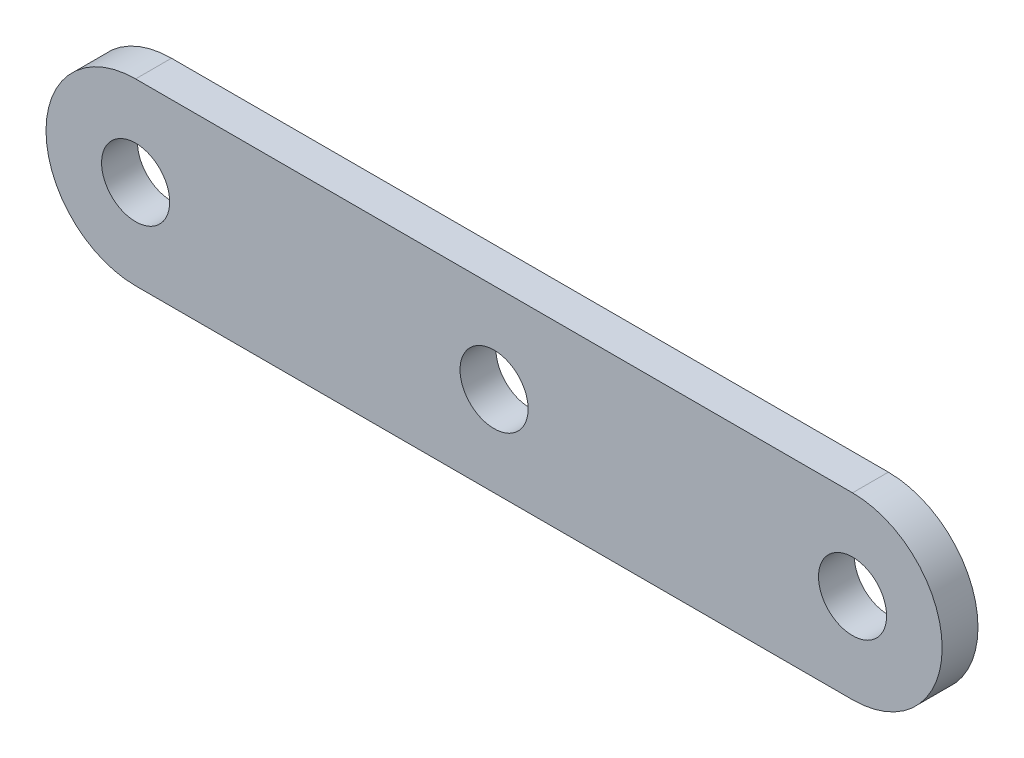
ISO-10303-21;
HEADER;
FILE_DESCRIPTION(('STEP AP214'),'2;1');
FILE_NAME('part.step','',(''),(''),'','','');
FILE_SCHEMA(('AUTOMOTIVE_DESIGN { 1 0 10303 214 1 1 1 1 }'));
ENDSEC;
DATA;
#1=APPLICATION_CONTEXT('core data for automotive mechanical design processes');
#2=APPLICATION_PROTOCOL_DEFINITION('international standard','automotive_design',2000,#1);
#3=PRODUCT_CONTEXT('',#1,'mechanical');
#4=PRODUCT('Part','Part','',(#3));
#5=PRODUCT_RELATED_PRODUCT_CATEGORY('part','',(#4));
#6=PRODUCT_DEFINITION_FORMATION('','',#4);
#7=PRODUCT_DEFINITION_CONTEXT('part definition',#1,'design');
#8=PRODUCT_DEFINITION('design','',#6,#7);
#9=PRODUCT_DEFINITION_SHAPE('','',#8);
#10=(LENGTH_UNIT() NAMED_UNIT(*) SI_UNIT(.MILLI.,.METRE.));
#11=(NAMED_UNIT(*) PLANE_ANGLE_UNIT() SI_UNIT($,.RADIAN.));
#12=(NAMED_UNIT(*) SI_UNIT($,.STERADIAN.) SOLID_ANGLE_UNIT());
#13=UNCERTAINTY_MEASURE_WITH_UNIT(LENGTH_MEASURE(1.E-05),#10,'distance_accuracy_value','');
#14=(GEOMETRIC_REPRESENTATION_CONTEXT(3) GLOBAL_UNCERTAINTY_ASSIGNED_CONTEXT((#13)) GLOBAL_UNIT_ASSIGNED_CONTEXT((#10,
#11,#12)) REPRESENTATION_CONTEXT('',''));
#15=CARTESIAN_POINT('',(0.,0.,0.));
#16=DIRECTION('',(0.,0.,1.));
#17=DIRECTION('',(1.,0.,0.));
#18=AXIS2_PLACEMENT_3D('',#15,#16,#17);
#19=CARTESIAN_POINT('',(-25.4,-3.46944695195361E-13,2.54000000000008));
#20=DIRECTION('',(0.,0.,-0.999999999999999));
#21=DIRECTION('',(-1.,0.,0.));
#22=AXIS2_PLACEMENT_3D('',#19,#20,#21);
#23=CYLINDRICAL_SURFACE('',#22,6.35);
#24=CARTESIAN_POINT('',(-25.4,-3.46944695195361E-13,0.));
#25=DIRECTION('',(0.,0.,0.999999999999999));
#26=DIRECTION('',(1.,0.,0.));
#27=AXIS2_PLACEMENT_3D('',#24,#25,#26);
#28=CIRCLE('',#27,6.35);
#29=CARTESIAN_POINT('',(-25.4000000000003,6.34999999999969,0.));
#30=VERTEX_POINT('',#29);
#31=CARTESIAN_POINT('',(-25.4000000000003,-6.35000000000032,0.));
#32=VERTEX_POINT('',#31);
#33=EDGE_CURVE('E97',#30,#32,#28,.T.);
#34=ORIENTED_EDGE('',*,*,#33,.T.);
#35=DIRECTION('',(0.,0.,-0.999999999999999));
#36=VECTOR('',#35,1.);
#37=CARTESIAN_POINT('',(-25.4000000000003,-6.35000000000032,2.54));
#38=LINE('',#37,#36);
#39=CARTESIAN_POINT('',(-25.4000000000003,-6.35000000000032,2.54));
#40=VERTEX_POINT('',#39);
#41=EDGE_CURVE('E11',#40,#32,#38,.T.);
#42=ORIENTED_EDGE('',*,*,#41,.F.);
#43=CARTESIAN_POINT('',(-25.4,-3.46944695195361E-13,2.54000000000008));
#44=DIRECTION('',(0.,0.,0.999999999999999));
#45=DIRECTION('',(1.,0.,0.));
#46=AXIS2_PLACEMENT_3D('',#43,#44,#45);
#47=CIRCLE('',#46,6.35);
#48=CARTESIAN_POINT('',(-25.4000000000003,6.34999999999969,2.54000000000004));
#49=VERTEX_POINT('',#48);
#50=EDGE_CURVE('E85',#49,#40,#47,.T.);
#51=ORIENTED_EDGE('',*,*,#50,.F.);
#52=DIRECTION('',(0.,0.,-0.999999999999999));
#53=VECTOR('',#52,1.);
#54=CARTESIAN_POINT('',(-25.4000000000003,6.34999999999969,2.54000000000004));
#55=LINE('',#54,#53);
#56=EDGE_CURVE('E93',#49,#30,#55,.T.);
#57=ORIENTED_EDGE('',*,*,#56,.T.);
#58=EDGE_LOOP('',(#34,#42,#51,#57));
#59=FACE_BOUND('',#58,.T.);
#60=ADVANCED_FACE('F34',(#59),#23,.T.);
#61=CARTESIAN_POINT('',(-25.4000000000003,-6.35000000000032,2.54));
#62=DIRECTION('',(0.,1.,0.));
#63=DIRECTION('',(-1.,0.,0.));
#64=AXIS2_PLACEMENT_3D('',#61,#62,#63);
#65=PLANE('',#64);
#66=DIRECTION('',(1.,0.,0.));
#67=VECTOR('',#66,1.);
#68=CARTESIAN_POINT('',(-25.4000000000003,-6.35000000000032,0.));
#69=LINE('',#68,#67);
#70=CARTESIAN_POINT('',(25.3999999999997,-6.35000000000033,0.));
#71=VERTEX_POINT('',#70);
#72=EDGE_CURVE('E89',#32,#71,#69,.T.);
#73=ORIENTED_EDGE('',*,*,#72,.T.);
#74=DIRECTION('',(0.,0.,-0.999999999999999));
#75=VECTOR('',#74,1.);
#76=CARTESIAN_POINT('',(25.3999999999997,-6.35000000000033,2.54));
#77=LINE('',#76,#75);
#78=CARTESIAN_POINT('',(25.3999999999997,-6.35000000000033,2.54));
#79=VERTEX_POINT('',#78);
#80=EDGE_CURVE('E42',#79,#71,#77,.T.);
#81=ORIENTED_EDGE('',*,*,#80,.F.);
#82=DIRECTION('',(1.,0.,0.));
#83=VECTOR('',#82,1.);
#84=CARTESIAN_POINT('',(-25.4000000000003,-6.35000000000032,2.54));
#85=LINE('',#84,#83);
#86=EDGE_CURVE('E80',#40,#79,#85,.T.);
#87=ORIENTED_EDGE('',*,*,#86,.F.);
#88=ORIENTED_EDGE('',*,*,#41,.T.);
#89=EDGE_LOOP('',(#73,#81,#87,#88));
#90=FACE_BOUND('',#89,.T.);
#91=ADVANCED_FACE('F88',(#90),#65,.F.);
#92=CARTESIAN_POINT('',(25.4,-3.33066907387547E-13,2.54000000000008));
#93=DIRECTION('',(0.,0.,-0.999999999999999));
#94=DIRECTION('',(-1.,0.,0.));
#95=AXIS2_PLACEMENT_3D('',#92,#93,#94);
#96=CYLINDRICAL_SURFACE('',#95,6.35);
#97=CARTESIAN_POINT('',(25.4,-3.33066907387547E-13,0.));
#98=DIRECTION('',(0.,0.,0.999999999999999));
#99=DIRECTION('',(-1.,0.,0.));
#100=AXIS2_PLACEMENT_3D('',#97,#98,#99);
#101=CIRCLE('',#100,6.35);
#102=CARTESIAN_POINT('',(25.3999999999997,6.34999999999968,0.));
#103=VERTEX_POINT('',#102);
#104=EDGE_CURVE('E67',#71,#103,#101,.T.);
#105=ORIENTED_EDGE('',*,*,#104,.T.);
#106=DIRECTION('',(0.,0.,-0.999999999999999));
#107=VECTOR('',#106,1.);
#108=CARTESIAN_POINT('',(25.3999999999997,6.34999999999968,2.54));
#109=LINE('',#108,#107);
#110=CARTESIAN_POINT('',(25.3999999999997,6.34999999999968,2.54));
#111=VERTEX_POINT('',#110);
#112=EDGE_CURVE('E90',#111,#103,#109,.T.);
#113=ORIENTED_EDGE('',*,*,#112,.F.);
#114=CARTESIAN_POINT('',(25.4,-3.33066907387547E-13,2.54000000000008));
#115=DIRECTION('',(0.,0.,0.999999999999999));
#116=DIRECTION('',(-1.,0.,0.));
#117=AXIS2_PLACEMENT_3D('',#114,#115,#116);
#118=CIRCLE('',#117,6.35);
#119=EDGE_CURVE('E83',#79,#111,#118,.T.);
#120=ORIENTED_EDGE('',*,*,#119,.F.);
#121=ORIENTED_EDGE('',*,*,#80,.T.);
#122=EDGE_LOOP('',(#105,#113,#120,#121));
#123=FACE_BOUND('',#122,.T.);
#124=ADVANCED_FACE('F91',(#123),#96,.T.);
#125=CARTESIAN_POINT('',(-25.4000000000003,6.34999999999969,2.54000000000004));
#126=DIRECTION('',(0.,-1.,0.));
#127=DIRECTION('',(0.,0.,-0.999999999999999));
#128=AXIS2_PLACEMENT_3D('',#125,#126,#127);
#129=PLANE('',#128);
#130=DIRECTION('',(-1.,0.,0.));
#131=VECTOR('',#130,1.);
#132=CARTESIAN_POINT('',(-25.4000000000003,6.34999999999969,0.));
#133=LINE('',#132,#131);
#134=EDGE_CURVE('E73',#103,#30,#133,.T.);
#135=ORIENTED_EDGE('',*,*,#134,.T.);
#136=ORIENTED_EDGE('',*,*,#56,.F.);
#137=DIRECTION('',(-1.,0.,0.));
#138=VECTOR('',#137,1.);
#139=CARTESIAN_POINT('',(-25.4000000000003,6.34999999999969,2.54000000000004));
#140=LINE('',#139,#138);
#141=EDGE_CURVE('E50',#111,#49,#140,.T.);
#142=ORIENTED_EDGE('',*,*,#141,.F.);
#143=ORIENTED_EDGE('',*,*,#112,.T.);
#144=EDGE_LOOP('',(#135,#136,#142,#143));
#145=FACE_BOUND('',#144,.T.);
#146=ADVANCED_FACE('F105',(#145),#129,.F.);
#147=CARTESIAN_POINT('',(-25.4,-3.46944695195361E-13,2.54000000000008));
#148=DIRECTION('',(0.,0.,0.999999999999999));
#149=DIRECTION('',(1.,0.,0.));
#150=AXIS2_PLACEMENT_3D('',#147,#148,#149);
#151=PLANE('',#150);
#152=CARTESIAN_POINT('',(25.4,-3.60822483003176E-13,2.54000000000008));
#153=DIRECTION('',(0.,0.,0.999999999999999));
#154=DIRECTION('',(1.,0.,0.));
#155=AXIS2_PLACEMENT_3D('',#152,#153,#154);
#156=CIRCLE('',#155,2.413);
#157=CARTESIAN_POINT('',(27.813,-3.60822483003176E-13,2.54000000000008));
#158=VERTEX_POINT('',#157);
#159=EDGE_CURVE('E122',#158,#158,#156,.T.);
#160=ORIENTED_EDGE('',*,*,#159,.F.);
#161=EDGE_LOOP('',(#160));
#162=FACE_BOUND('',#161,.T.);
#163=CARTESIAN_POINT('',(0.,0.,2.54));
#164=DIRECTION('',(0.,0.,0.999999999999999));
#165=DIRECTION('',(1.,0.,0.));
#166=AXIS2_PLACEMENT_3D('',#163,#164,#165);
#167=CIRCLE('',#166,2.413);
#168=CARTESIAN_POINT('',(2.413,0.,2.54));
#169=VERTEX_POINT('',#168);
#170=EDGE_CURVE('E114',#169,#169,#167,.T.);
#171=ORIENTED_EDGE('',*,*,#170,.F.);
#172=EDGE_LOOP('',(#171));
#173=FACE_BOUND('',#172,.T.);
#174=CARTESIAN_POINT('',(-25.4,-3.46944695195361E-13,2.54000000000008));
#175=DIRECTION('',(0.,0.,0.999999999999999));
#176=DIRECTION('',(1.,0.,0.));
#177=AXIS2_PLACEMENT_3D('',#174,#175,#176);
#178=CIRCLE('',#177,2.413);
#179=CARTESIAN_POINT('',(-22.987,-3.46944695195361E-13,2.54000000000008));
#180=VERTEX_POINT('',#179);
#181=EDGE_CURVE('E111',#180,#180,#178,.T.);
#182=ORIENTED_EDGE('',*,*,#181,.F.);
#183=EDGE_LOOP('',(#182));
#184=FACE_BOUND('',#183,.T.);
#185=ORIENTED_EDGE('',*,*,#50,.T.);
#186=ORIENTED_EDGE('',*,*,#86,.T.);
#187=ORIENTED_EDGE('',*,*,#119,.T.);
#188=ORIENTED_EDGE('',*,*,#141,.T.);
#189=EDGE_LOOP('',(#185,#186,#187,#188));
#190=FACE_BOUND('',#189,.T.);
#191=ADVANCED_FACE('F81',(#162,#173,#184,#190),#151,.T.);
#192=CARTESIAN_POINT('',(-25.4,-3.46944695195361E-13,0.));
#193=DIRECTION('',(0.,0.,0.999999999999999));
#194=DIRECTION('',(1.,0.,0.));
#195=AXIS2_PLACEMENT_3D('',#192,#193,#194);
#196=PLANE('',#195);
#197=CARTESIAN_POINT('',(25.4,-3.60822483003176E-13,0.));
#198=DIRECTION('',(0.,0.,0.999999999999999));
#199=DIRECTION('',(1.,0.,0.));
#200=AXIS2_PLACEMENT_3D('',#197,#198,#199);
#201=CIRCLE('',#200,2.413);
#202=CARTESIAN_POINT('',(27.813,-3.60822483003176E-13,0.));
#203=VERTEX_POINT('',#202);
#204=EDGE_CURVE('E125',#203,#203,#201,.T.);
#205=ORIENTED_EDGE('',*,*,#204,.T.);
#206=EDGE_LOOP('',(#205));
#207=FACE_BOUND('',#206,.T.);
#208=CARTESIAN_POINT('',(0.,0.,0.));
#209=DIRECTION('',(0.,0.,0.999999999999999));
#210=DIRECTION('',(1.,0.,0.));
#211=AXIS2_PLACEMENT_3D('',#208,#209,#210);
#212=CIRCLE('',#211,2.413);
#213=CARTESIAN_POINT('',(2.413,0.,0.));
#214=VERTEX_POINT('',#213);
#215=EDGE_CURVE('E119',#214,#214,#212,.T.);
#216=ORIENTED_EDGE('',*,*,#215,.T.);
#217=EDGE_LOOP('',(#216));
#218=FACE_BOUND('',#217,.T.);
#219=CARTESIAN_POINT('',(-25.4,-3.46944695195361E-13,0.));
#220=DIRECTION('',(0.,0.,0.999999999999999));
#221=DIRECTION('',(1.,0.,0.));
#222=AXIS2_PLACEMENT_3D('',#219,#220,#221);
#223=CIRCLE('',#222,2.413);
#224=CARTESIAN_POINT('',(-22.987,-3.46944695195361E-13,0.));
#225=VERTEX_POINT('',#224);
#226=EDGE_CURVE('E100',#225,#225,#223,.T.);
#227=ORIENTED_EDGE('',*,*,#226,.T.);
#228=EDGE_LOOP('',(#227));
#229=FACE_BOUND('',#228,.T.);
#230=ORIENTED_EDGE('',*,*,#33,.F.);
#231=ORIENTED_EDGE('',*,*,#134,.F.);
#232=ORIENTED_EDGE('',*,*,#104,.F.);
#233=ORIENTED_EDGE('',*,*,#72,.F.);
#234=EDGE_LOOP('',(#230,#231,#232,#233));
#235=FACE_BOUND('',#234,.T.);
#236=ADVANCED_FACE('F108',(#207,#218,#229,#235),#196,.F.);
#237=CARTESIAN_POINT('',(-25.4,-3.46944695195361E-13,0.));
#238=DIRECTION('',(0.,0.,0.999999999999999));
#239=DIRECTION('',(1.,0.,0.));
#240=AXIS2_PLACEMENT_3D('',#237,#238,#239);
#241=CYLINDRICAL_SURFACE('',#240,2.413);
#242=CARTESIAN_POINT('',(-22.987,-3.46944695195361E-13,0.));
#243=CARTESIAN_POINT('',(-22.987,-3.46944695195361E-13,0.0264583333333736));
#244=CARTESIAN_POINT('',(-22.987,-3.46944695195361E-13,0.0529166666667073));
#245=CARTESIAN_POINT('',(-22.987,-3.46944695195361E-13,0.105833333333375));
#246=CARTESIAN_POINT('',(-22.987,-3.46944695195361E-13,0.132291666666708));
#247=CARTESIAN_POINT('',(-22.987,-3.46944695195361E-13,0.185208333333376));
#248=CARTESIAN_POINT('',(-22.987,-3.46944695195361E-13,0.21166666666671));
#249=CARTESIAN_POINT('',(-22.987,-3.46944695195361E-13,0.264583333333377));
#250=CARTESIAN_POINT('',(-22.987,-3.46944695195361E-13,0.291041666666711));
#251=CARTESIAN_POINT('',(-22.987,-3.46944695195361E-13,0.343958333333378));
#252=CARTESIAN_POINT('',(-22.987,-3.46944695195361E-13,0.370416666666712));
#253=CARTESIAN_POINT('',(-22.987,-3.46944695195361E-13,0.423333333333379));
#254=CARTESIAN_POINT('',(-22.987,-3.46944695195361E-13,0.449791666666713));
#255=CARTESIAN_POINT('',(-22.987,-3.46944695195361E-13,0.50270833333338));
#256=CARTESIAN_POINT('',(-22.987,-3.46944695195361E-13,0.529166666666714));
#257=CARTESIAN_POINT('',(-22.987,-3.46944695195361E-13,0.582083333333382));
#258=CARTESIAN_POINT('',(-22.987,-3.46944695195361E-13,0.608541666666715));
#259=CARTESIAN_POINT('',(-22.987,-3.46944695195361E-13,0.661458333333383));
#260=CARTESIAN_POINT('',(-22.987,-3.46944695195361E-13,0.687916666666716));
#261=CARTESIAN_POINT('',(-22.987,-3.46944695195361E-13,0.740833333333384));
#262=CARTESIAN_POINT('',(-22.987,-3.46944695195361E-13,0.767291666666718));
#263=CARTESIAN_POINT('',(-22.987,-3.46944695195361E-13,0.820208333333385));
#264=CARTESIAN_POINT('',(-22.987,-3.46944695195361E-13,0.846666666666719));
#265=CARTESIAN_POINT('',(-22.987,-3.46944695195361E-13,0.899583333333386));
#266=CARTESIAN_POINT('',(-22.987,-3.46944695195361E-13,0.92604166666672));
#267=CARTESIAN_POINT('',(-22.987,-3.46944695195361E-13,0.978958333333387));
#268=CARTESIAN_POINT('',(-22.987,-3.46944695195361E-13,1.00541666666672));
#269=CARTESIAN_POINT('',(-22.987,-3.46944695195361E-13,1.05833333333339));
#270=CARTESIAN_POINT('',(-22.987,-3.46944695195361E-13,1.08479166666672));
#271=CARTESIAN_POINT('',(-22.987,-3.46944695195361E-13,1.13770833333339));
#272=CARTESIAN_POINT('',(-22.987,-3.46944695195361E-13,1.16416666666672));
#273=CARTESIAN_POINT('',(-22.987,-3.46944695195361E-13,1.21708333333339));
#274=CARTESIAN_POINT('',(-22.987,-3.46944695195361E-13,1.24354166666672));
#275=CARTESIAN_POINT('',(-22.987,-3.46944695195361E-13,1.29645833333339));
#276=CARTESIAN_POINT('',(-22.987,-3.46944695195361E-13,1.32291666666673));
#277=CARTESIAN_POINT('',(-22.987,-3.46944695195361E-13,1.37583333333339));
#278=CARTESIAN_POINT('',(-22.987,-3.46944695195361E-13,1.40229166666673));
#279=CARTESIAN_POINT('',(-22.987,-3.46944695195361E-13,1.45520833333339));
#280=CARTESIAN_POINT('',(-22.987,-3.46944695195361E-13,1.48166666666673));
#281=CARTESIAN_POINT('',(-22.987,-3.46944695195361E-13,1.5345833333334));
#282=CARTESIAN_POINT('',(-22.987,-3.46944695195361E-13,1.56104166666673));
#283=CARTESIAN_POINT('',(-22.987,-3.46944695195361E-13,1.6139583333334));
#284=CARTESIAN_POINT('',(-22.987,-3.46944695195361E-13,1.64041666666673));
#285=CARTESIAN_POINT('',(-22.987,-3.46944695195361E-13,1.6933333333334));
#286=CARTESIAN_POINT('',(-22.987,-3.46944695195361E-13,1.71979166666673));
#287=CARTESIAN_POINT('',(-22.987,-3.46944695195361E-13,1.7727083333334));
#288=CARTESIAN_POINT('',(-22.987,-3.46944695195361E-13,1.79916666666673));
#289=CARTESIAN_POINT('',(-22.987,-3.46944695195361E-13,1.8520833333334));
#290=CARTESIAN_POINT('',(-22.987,-3.46944695195361E-13,1.87854166666673));
#291=CARTESIAN_POINT('',(-22.987,-3.46944695195361E-13,1.9314583333334));
#292=CARTESIAN_POINT('',(-22.987,-3.46944695195361E-13,1.95791666666673));
#293=CARTESIAN_POINT('',(-22.987,-3.46944695195361E-13,2.0108333333334));
#294=CARTESIAN_POINT('',(-22.987,-3.46944695195361E-13,2.03729166666674));
#295=CARTESIAN_POINT('',(-22.987,-3.46944695195361E-13,2.0902083333334));
#296=CARTESIAN_POINT('',(-22.987,-3.46944695195361E-13,2.11666666666674));
#297=CARTESIAN_POINT('',(-22.987,-3.46944695195361E-13,2.1695833333334));
#298=CARTESIAN_POINT('',(-22.987,-3.46944695195361E-13,2.19604166666674));
#299=CARTESIAN_POINT('',(-22.987,-3.46944695195361E-13,2.24895833333341));
#300=CARTESIAN_POINT('',(-22.987,-3.46944695195361E-13,2.27541666666674));
#301=CARTESIAN_POINT('',(-22.987,-3.46944695195361E-13,2.32833333333341));
#302=CARTESIAN_POINT('',(-22.987,-3.46944695195361E-13,2.35479166666674));
#303=CARTESIAN_POINT('',(-22.987,-3.46944695195361E-13,2.40770833333341));
#304=CARTESIAN_POINT('',(-22.987,-3.46944695195361E-13,2.43416666666674));
#305=CARTESIAN_POINT('',(-22.987,-3.46944695195361E-13,2.48708333333341));
#306=CARTESIAN_POINT('',(-22.987,-3.46944695195361E-13,2.51354166666674));
#307=CARTESIAN_POINT('',(-22.987,-3.46944695195361E-13,2.54000000000008));
#308=B_SPLINE_CURVE_WITH_KNOTS('',3,(#242,#243,#244,#245,#246,#247,#248,#249,#250,#251,#252,
#253,#254,#255,#256,#257,#258,#259,#260,#261,#262,#263,#264,#265,#266,#267,#268,#269,#270,#271,
#272,#273,#274,#275,#276,#277,#278,#279,#280,#281,#282,#283,#284,#285,#286,#287,#288,#289,#290,
#291,#292,#293,#294,#295,#296,#297,#298,#299,#300,#301,#302,#303,#304,#305,#306,#307),
.UNSPECIFIED.,.F.,.F.,(4,2,2,2,2,2,2,2,2,2,2,2,2,2,2,2,2,2,2,2,2,2,2,2,2,2,2,2,2,2,2,2,4),(0.,
0.0793750000000011,0.158750000000002,0.238125000000003,0.317500000000005,0.396875000000006,
0.476250000000007,0.555625000000008,0.635000000000009,0.71437500000001,0.793750000000011,
0.873125000000013,0.952500000000014,1.03187500000001,1.11125000000002,1.19062500000002,
1.27000000000002,1.34937500000002,1.42875000000002,1.50812500000002,1.58750000000002,
1.66687500000002,1.74625000000003,1.82562500000003,1.90500000000003,1.98437500000003,
2.06375000000003,2.14312500000003,2.22250000000003,2.30187500000003,2.38125000000003,
2.46062500000004,2.54000000000004),.UNSPECIFIED.);
#309=EDGE_CURVE('BSEAM145',#225,#180,#308,.T.);
#310=ORIENTED_EDGE('',*,*,#226,.F.);
#311=ORIENTED_EDGE('',*,*,#181,.T.);
#312=ORIENTED_EDGE('',*,*,#309,.T.);
#313=ORIENTED_EDGE('',*,*,#309,.F.);
#314=EDGE_LOOP('',(#310,#312,#311,#313));
#315=FACE_BOUND('',#314,.T.);
#316=ADVANCED_FACE('F145',(#315),#241,.F.);
#317=CARTESIAN_POINT('',(0.,0.,0.));
#318=DIRECTION('',(0.,0.,0.999999999999999));
#319=DIRECTION('',(1.,0.,0.));
#320=AXIS2_PLACEMENT_3D('',#317,#318,#319);
#321=CYLINDRICAL_SURFACE('',#320,2.413);
#322=CARTESIAN_POINT('',(2.413,0.,0.));
#323=CARTESIAN_POINT('',(2.413,0.,0.0264583333333334));
#324=CARTESIAN_POINT('',(2.413,0.,0.0529166666666667));
#325=CARTESIAN_POINT('',(2.413,0.,0.105833333333333));
#326=CARTESIAN_POINT('',(2.413,0.,0.132291666666667));
#327=CARTESIAN_POINT('',(2.413,0.,0.185208333333333));
#328=CARTESIAN_POINT('',(2.413,0.,0.211666666666667));
#329=CARTESIAN_POINT('',(2.413,0.,0.264583333333334));
#330=CARTESIAN_POINT('',(2.413,0.,0.291041666666667));
#331=CARTESIAN_POINT('',(2.413,0.,0.343958333333334));
#332=CARTESIAN_POINT('',(2.413,0.,0.370416666666667));
#333=CARTESIAN_POINT('',(2.413,0.,0.423333333333334));
#334=CARTESIAN_POINT('',(2.413,0.,0.449791666666667));
#335=CARTESIAN_POINT('',(2.413,0.,0.502708333333334));
#336=CARTESIAN_POINT('',(2.413,0.,0.529166666666667));
#337=CARTESIAN_POINT('',(2.413,0.,0.582083333333334));
#338=CARTESIAN_POINT('',(2.413,0.,0.608541666666667));
#339=CARTESIAN_POINT('',(2.413,0.,0.661458333333334));
#340=CARTESIAN_POINT('',(2.413,0.,0.687916666666667));
#341=CARTESIAN_POINT('',(2.413,0.,0.740833333333334));
#342=CARTESIAN_POINT('',(2.413,0.,0.767291666666667));
#343=CARTESIAN_POINT('',(2.413,0.,0.820208333333334));
#344=CARTESIAN_POINT('',(2.413,0.,0.846666666666667));
#345=CARTESIAN_POINT('',(2.413,0.,0.899583333333334));
#346=CARTESIAN_POINT('',(2.413,0.,0.926041666666667));
#347=CARTESIAN_POINT('',(2.413,0.,0.978958333333334));
#348=CARTESIAN_POINT('',(2.413,0.,1.00541666666667));
#349=CARTESIAN_POINT('',(2.413,0.,1.05833333333333));
#350=CARTESIAN_POINT('',(2.413,0.,1.08479166666667));
#351=CARTESIAN_POINT('',(2.413,0.,1.13770833333333));
#352=CARTESIAN_POINT('',(2.413,0.,1.16416666666667));
#353=CARTESIAN_POINT('',(2.413,0.,1.21708333333333));
#354=CARTESIAN_POINT('',(2.413,0.,1.24354166666667));
#355=CARTESIAN_POINT('',(2.413,0.,1.29645833333333));
#356=CARTESIAN_POINT('',(2.413,0.,1.32291666666667));
#357=CARTESIAN_POINT('',(2.413,0.,1.37583333333333));
#358=CARTESIAN_POINT('',(2.413,0.,1.40229166666667));
#359=CARTESIAN_POINT('',(2.413,0.,1.45520833333333));
#360=CARTESIAN_POINT('',(2.413,0.,1.48166666666667));
#361=CARTESIAN_POINT('',(2.413,0.,1.53458333333333));
#362=CARTESIAN_POINT('',(2.413,0.,1.56104166666667));
#363=CARTESIAN_POINT('',(2.413,0.,1.61395833333333));
#364=CARTESIAN_POINT('',(2.413,0.,1.64041666666667));
#365=CARTESIAN_POINT('',(2.413,0.,1.69333333333333));
#366=CARTESIAN_POINT('',(2.413,0.,1.71979166666667));
#367=CARTESIAN_POINT('',(2.413,0.,1.77270833333333));
#368=CARTESIAN_POINT('',(2.413,0.,1.79916666666667));
#369=CARTESIAN_POINT('',(2.413,0.,1.85208333333333));
#370=CARTESIAN_POINT('',(2.413,0.,1.87854166666667));
#371=CARTESIAN_POINT('',(2.413,0.,1.93145833333333));
#372=CARTESIAN_POINT('',(2.413,0.,1.95791666666667));
#373=CARTESIAN_POINT('',(2.413,0.,2.01083333333333));
#374=CARTESIAN_POINT('',(2.413,0.,2.03729166666667));
#375=CARTESIAN_POINT('',(2.413,0.,2.09020833333333));
#376=CARTESIAN_POINT('',(2.413,0.,2.11666666666667));
#377=CARTESIAN_POINT('',(2.413,0.,2.16958333333333));
#378=CARTESIAN_POINT('',(2.413,0.,2.19604166666667));
#379=CARTESIAN_POINT('',(2.413,0.,2.24895833333333));
#380=CARTESIAN_POINT('',(2.413,0.,2.27541666666667));
#381=CARTESIAN_POINT('',(2.413,0.,2.32833333333333));
#382=CARTESIAN_POINT('',(2.413,0.,2.35479166666667));
#383=CARTESIAN_POINT('',(2.413,0.,2.40770833333334));
#384=CARTESIAN_POINT('',(2.413,0.,2.43416666666667));
#385=CARTESIAN_POINT('',(2.413,0.,2.48708333333333));
#386=CARTESIAN_POINT('',(2.413,0.,2.51354166666667));
#387=CARTESIAN_POINT('',(2.413,0.,2.54));
#388=B_SPLINE_CURVE_WITH_KNOTS('',3,(#322,#323,#324,#325,#326,#327,#328,#329,#330,#331,#332,
#333,#334,#335,#336,#337,#338,#339,#340,#341,#342,#343,#344,#345,#346,#347,#348,#349,#350,#351,
#352,#353,#354,#355,#356,#357,#358,#359,#360,#361,#362,#363,#364,#365,#366,#367,#368,#369,#370,
#371,#372,#373,#374,#375,#376,#377,#378,#379,#380,#381,#382,#383,#384,#385,#386,#387),
.UNSPECIFIED.,.F.,.F.,(4,2,2,2,2,2,2,2,2,2,2,2,2,2,2,2,2,2,2,2,2,2,2,2,2,2,2,2,2,2,2,2,4),(0.,
0.0793750000000001,0.15875,0.238125,0.3175,0.396875,0.47625,0.555625,0.635,0.714375000000001,
0.793750000000001,0.873125000000001,0.952500000000001,1.031875,1.11125,1.190625,1.27,1.349375,
1.42875,1.508125,1.5875,1.666875,1.74625,1.825625,1.905,1.984375,2.06375,2.143125,2.2225,
2.301875,2.38125,2.460625,2.54),.UNSPECIFIED.);
#389=EDGE_CURVE('BSEAM134',#214,#169,#388,.T.);
#390=ORIENTED_EDGE('',*,*,#215,.F.);
#391=ORIENTED_EDGE('',*,*,#170,.T.);
#392=ORIENTED_EDGE('',*,*,#389,.T.);
#393=ORIENTED_EDGE('',*,*,#389,.F.);
#394=EDGE_LOOP('',(#390,#392,#391,#393));
#395=FACE_BOUND('',#394,.T.);
#396=ADVANCED_FACE('F134',(#395),#321,.F.);
#397=CARTESIAN_POINT('',(25.4,-3.60822483003176E-13,0.));
#398=DIRECTION('',(0.,0.,0.999999999999999));
#399=DIRECTION('',(1.,0.,0.));
#400=AXIS2_PLACEMENT_3D('',#397,#398,#399);
#401=CYLINDRICAL_SURFACE('',#400,2.413);
#402=CARTESIAN_POINT('',(27.813,-3.60822483003176E-13,0.));
#403=CARTESIAN_POINT('',(27.813,-3.60822483003176E-13,0.0264583333333771));
#404=CARTESIAN_POINT('',(27.813,-3.60822483003176E-13,0.0529166666667108));
#405=CARTESIAN_POINT('',(27.813,-3.60822483003176E-13,0.105833333333378));
#406=CARTESIAN_POINT('',(27.813,-3.60822483003176E-13,0.132291666666712));
#407=CARTESIAN_POINT('',(27.813,-3.60822483003176E-13,0.185208333333379));
#408=CARTESIAN_POINT('',(27.813,-3.60822483003176E-13,0.211666666666713));
#409=CARTESIAN_POINT('',(27.813,-3.60822483003176E-13,0.264583333333381));
#410=CARTESIAN_POINT('',(27.813,-3.60822483003176E-13,0.291041666666714));
#411=CARTESIAN_POINT('',(27.813,-3.60822483003176E-13,0.343958333333382));
#412=CARTESIAN_POINT('',(27.813,-3.60822483003176E-13,0.370416666666716));
#413=CARTESIAN_POINT('',(27.813,-3.60822483003176E-13,0.423333333333383));
#414=CARTESIAN_POINT('',(27.813,-3.60822483003176E-13,0.449791666666717));
#415=CARTESIAN_POINT('',(27.813,-3.60822483003176E-13,0.502708333333384));
#416=CARTESIAN_POINT('',(27.813,-3.60822483003176E-13,0.529166666666718));
#417=CARTESIAN_POINT('',(27.813,-3.60822483003176E-13,0.582083333333385));
#418=CARTESIAN_POINT('',(27.813,-3.60822483003176E-13,0.608541666666719));
#419=CARTESIAN_POINT('',(27.813,-3.60822483003176E-13,0.661458333333387));
#420=CARTESIAN_POINT('',(27.813,-3.60822483003176E-13,0.68791666666672));
#421=CARTESIAN_POINT('',(27.813,-3.60822483003176E-13,0.740833333333388));
#422=CARTESIAN_POINT('',(27.813,-3.60822483003176E-13,0.767291666666722));
#423=CARTESIAN_POINT('',(27.813,-3.60822483003176E-13,0.820208333333389));
#424=CARTESIAN_POINT('',(27.813,-3.60822483003176E-13,0.846666666666723));
#425=CARTESIAN_POINT('',(27.813,-3.60822483003176E-13,0.89958333333339));
#426=CARTESIAN_POINT('',(27.813,-3.60822483003176E-13,0.926041666666724));
#427=CARTESIAN_POINT('',(27.813,-3.60822483003176E-13,0.978958333333392));
#428=CARTESIAN_POINT('',(27.813,-3.60822483003176E-13,1.00541666666673));
#429=CARTESIAN_POINT('',(27.813,-3.60822483003176E-13,1.05833333333339));
#430=CARTESIAN_POINT('',(27.813,-3.60822483003176E-13,1.08479166666673));
#431=CARTESIAN_POINT('',(27.813,-3.60822483003176E-13,1.13770833333339));
#432=CARTESIAN_POINT('',(27.813,-3.60822483003176E-13,1.16416666666673));
#433=CARTESIAN_POINT('',(27.813,-3.60822483003176E-13,1.2170833333334));
#434=CARTESIAN_POINT('',(27.813,-3.60822483003176E-13,1.24354166666673));
#435=CARTESIAN_POINT('',(27.813,-3.60822483003176E-13,1.2964583333334));
#436=CARTESIAN_POINT('',(27.813,-3.60822483003176E-13,1.32291666666673));
#437=CARTESIAN_POINT('',(27.813,-3.60822483003176E-13,1.3758333333334));
#438=CARTESIAN_POINT('',(27.813,-3.60822483003176E-13,1.40229166666673));
#439=CARTESIAN_POINT('',(27.813,-3.60822483003176E-13,1.4552083333334));
#440=CARTESIAN_POINT('',(27.813,-3.60822483003176E-13,1.48166666666673));
#441=CARTESIAN_POINT('',(27.813,-3.60822483003176E-13,1.5345833333334));
#442=CARTESIAN_POINT('',(27.813,-3.60822483003176E-13,1.56104166666673));
#443=CARTESIAN_POINT('',(27.813,-3.60822483003176E-13,1.6139583333334));
#444=CARTESIAN_POINT('',(27.813,-3.60822483003176E-13,1.64041666666673));
#445=CARTESIAN_POINT('',(27.813,-3.60822483003176E-13,1.6933333333334));
#446=CARTESIAN_POINT('',(27.813,-3.60822483003176E-13,1.71979166666674));
#447=CARTESIAN_POINT('',(27.813,-3.60822483003176E-13,1.7727083333334));
#448=CARTESIAN_POINT('',(27.813,-3.60822483003176E-13,1.79916666666674));
#449=CARTESIAN_POINT('',(27.813,-3.60822483003176E-13,1.8520833333334));
#450=CARTESIAN_POINT('',(27.813,-3.60822483003176E-13,1.87854166666674));
#451=CARTESIAN_POINT('',(27.813,-3.60822483003176E-13,1.93145833333341));
#452=CARTESIAN_POINT('',(27.813,-3.60822483003176E-13,1.95791666666674));
#453=CARTESIAN_POINT('',(27.813,-3.60822483003176E-13,2.01083333333341));
#454=CARTESIAN_POINT('',(27.813,-3.60822483003176E-13,2.03729166666674));
#455=CARTESIAN_POINT('',(27.813,-3.60822483003176E-13,2.09020833333341));
#456=CARTESIAN_POINT('',(27.813,-3.60822483003176E-13,2.11666666666674));
#457=CARTESIAN_POINT('',(27.813,-3.60822483003176E-13,2.16958333333341));
#458=CARTESIAN_POINT('',(27.813,-3.60822483003176E-13,2.19604166666674));
#459=CARTESIAN_POINT('',(27.813,-3.60822483003176E-13,2.24895833333341));
#460=CARTESIAN_POINT('',(27.813,-3.60822483003176E-13,2.27541666666674));
#461=CARTESIAN_POINT('',(27.813,-3.60822483003176E-13,2.32833333333341));
#462=CARTESIAN_POINT('',(27.813,-3.60822483003176E-13,2.35479166666675));
#463=CARTESIAN_POINT('',(27.813,-3.60822483003176E-13,2.40770833333341));
#464=CARTESIAN_POINT('',(27.813,-3.60822483003176E-13,2.43416666666675));
#465=CARTESIAN_POINT('',(27.813,-3.60822483003176E-13,2.48708333333341));
#466=CARTESIAN_POINT('',(27.813,-3.60822483003176E-13,2.51354166666675));
#467=CARTESIAN_POINT('',(27.813,-3.60822483003176E-13,2.54000000000008));
#468=B_SPLINE_CURVE_WITH_KNOTS('',3,(#402,#403,#404,#405,#406,#407,#408,#409,#410,#411,#412,
#413,#414,#415,#416,#417,#418,#419,#420,#421,#422,#423,#424,#425,#426,#427,#428,#429,#430,#431,
#432,#433,#434,#435,#436,#437,#438,#439,#440,#441,#442,#443,#444,#445,#446,#447,#448,#449,#450,
#451,#452,#453,#454,#455,#456,#457,#458,#459,#460,#461,#462,#463,#464,#465,#466,#467),
.UNSPECIFIED.,.F.,.F.,(4,2,2,2,2,2,2,2,2,2,2,2,2,2,2,2,2,2,2,2,2,2,2,2,2,2,2,2,2,2,2,2,4),(0.,
0.0793750000000012,0.158750000000002,0.238125000000004,0.317500000000005,0.396875000000006,
0.476250000000007,0.555625000000008,0.63500000000001,0.714375000000011,0.793750000000012,
0.873125000000013,0.952500000000014,1.03187500000002,1.11125000000002,1.19062500000002,
1.27000000000002,1.34937500000002,1.42875000000002,1.50812500000002,1.58750000000002,
1.66687500000003,1.74625000000003,1.82562500000003,1.90500000000003,1.98437500000003,
2.06375000000003,2.14312500000003,2.22250000000003,2.30187500000003,2.38125000000004,
2.46062500000004,2.54000000000004),.UNSPECIFIED.);
#469=EDGE_CURVE('BSEAM131',#203,#158,#468,.T.);
#470=ORIENTED_EDGE('',*,*,#204,.F.);
#471=ORIENTED_EDGE('',*,*,#159,.T.);
#472=ORIENTED_EDGE('',*,*,#469,.T.);
#473=ORIENTED_EDGE('',*,*,#469,.F.);
#474=EDGE_LOOP('',(#470,#472,#471,#473));
#475=FACE_BOUND('',#474,.T.);
#476=ADVANCED_FACE('F131',(#475),#401,.F.);
#477=CLOSED_SHELL('',(#60,#91,#124,#146,#191,#236,#316,#396,#476));
#478=MANIFOLD_SOLID_BREP('B2',#477);
#479=ADVANCED_BREP_SHAPE_REPRESENTATION('',(#18,#478),#14);
#480=SHAPE_DEFINITION_REPRESENTATION(#9,#479);
ENDSEC;
END-ISO-10303-21;
